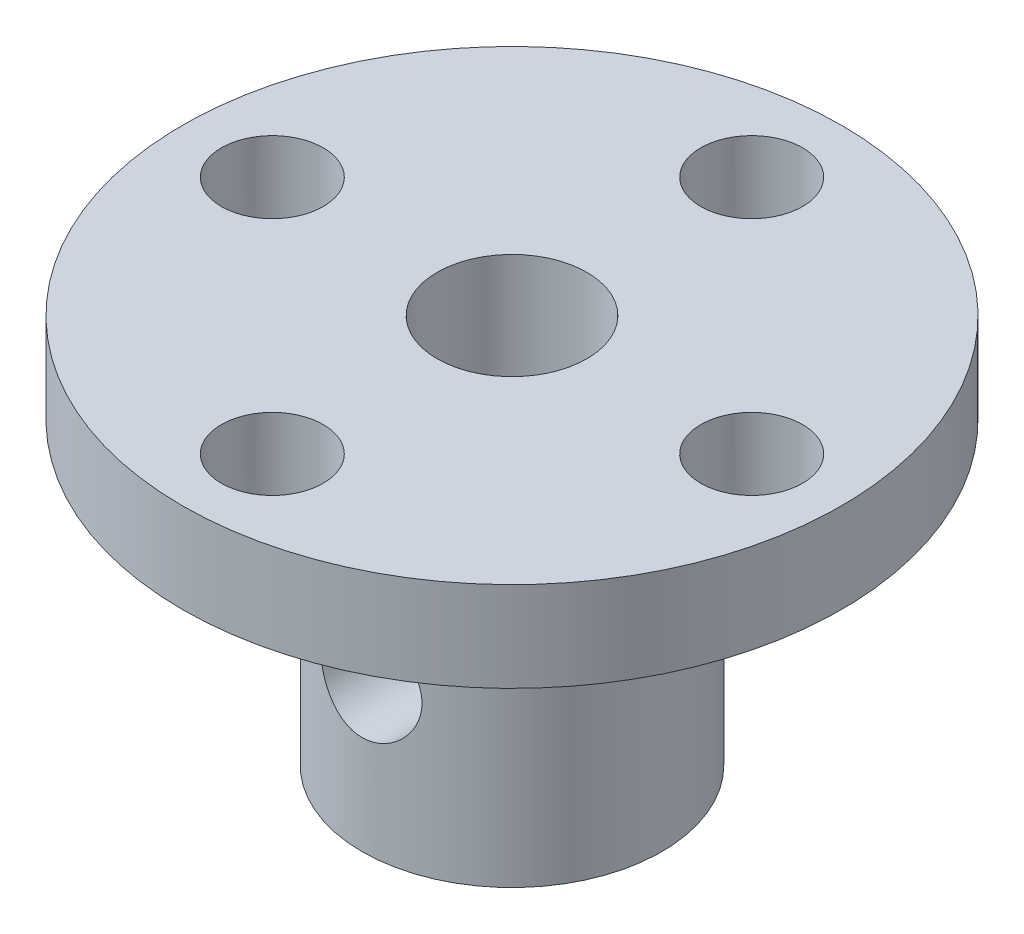
ISO-10303-21;
HEADER;
FILE_DESCRIPTION(('STEP AP214'),'2;1');
FILE_NAME('part.step','',(''),(''),'','','');
FILE_SCHEMA(('AUTOMOTIVE_DESIGN { 1 0 10303 214 1 1 1 1 }'));
ENDSEC;
DATA;
#1=APPLICATION_CONTEXT('core data for automotive mechanical design processes');
#2=APPLICATION_PROTOCOL_DEFINITION('international standard','automotive_design',2000,#1);
#3=PRODUCT_CONTEXT('',#1,'mechanical');
#4=PRODUCT('Part','Part','',(#3));
#5=PRODUCT_RELATED_PRODUCT_CATEGORY('part','',(#4));
#6=PRODUCT_DEFINITION_FORMATION('','',#4);
#7=PRODUCT_DEFINITION_CONTEXT('part definition',#1,'design');
#8=PRODUCT_DEFINITION('design','',#6,#7);
#9=PRODUCT_DEFINITION_SHAPE('','',#8);
#10=(LENGTH_UNIT() NAMED_UNIT(*) SI_UNIT(.MILLI.,.METRE.));
#11=(NAMED_UNIT(*) PLANE_ANGLE_UNIT() SI_UNIT($,.RADIAN.));
#12=(NAMED_UNIT(*) SI_UNIT($,.STERADIAN.) SOLID_ANGLE_UNIT());
#13=UNCERTAINTY_MEASURE_WITH_UNIT(LENGTH_MEASURE(1.E-05),#10,'distance_accuracy_value','');
#14=(GEOMETRIC_REPRESENTATION_CONTEXT(3) GLOBAL_UNCERTAINTY_ASSIGNED_CONTEXT((#13)) GLOBAL_UNIT_ASSIGNED_CONTEXT((#10,
#11,#12)) REPRESENTATION_CONTEXT('',''));
#15=CARTESIAN_POINT('',(0.,0.,0.));
#16=DIRECTION('',(0.,0.,1.));
#17=DIRECTION('',(1.,0.,0.));
#18=AXIS2_PLACEMENT_3D('',#15,#16,#17);
#19=CARTESIAN_POINT('',(0.,0.,0.));
#20=DIRECTION('',(0.,1.,0.));
#21=DIRECTION('',(0.,0.,1.));
#22=AXIS2_PLACEMENT_3D('',#19,#20,#21);
#23=CYLINDRICAL_SURFACE('',#22,2.5);
#24=CARTESIAN_POINT('',(0.,-9.7,2.5));
#25=CARTESIAN_POINT('',(-0.0850387979834848,-9.69999816919035,2.49999820045218));
#26=CARTESIAN_POINT('',(-0.170094671437286,-9.69358183789239,2.49562229986158));
#27=CARTESIAN_POINT('',(-0.337492388275739,-9.66831575022715,2.47854651486028));
#28=CARTESIAN_POINT('',(-0.419832331114429,-9.64945747328048,2.46584092609253));
#29=CARTESIAN_POINT('',(-0.579108454340916,-9.60048366597368,2.43335465994413));
#30=CARTESIAN_POINT('',(-0.656068830144872,-9.57042298816727,2.41360847686574));
#31=CARTESIAN_POINT('',(-0.803514973680363,-9.50034485089679,2.36861016322125));
#32=CARTESIAN_POINT('',(-0.874000009216633,-9.46032626734112,2.34335741108957));
#33=CARTESIAN_POINT('',(-1.01337366890706,-9.36772415903246,2.28674616980003));
#34=CARTESIAN_POINT('',(-1.0815991382831,-9.31435414759578,2.25504877517144));
#35=CARTESIAN_POINT('',(-1.20875003224094,-9.19847308611668,2.18953227494941));
#36=CARTESIAN_POINT('',(-1.26766159293667,-9.13594867115336,2.155710109245));
#37=CARTESIAN_POINT('',(-1.38446899403555,-8.99158688341645,2.08295824442802));
#38=CARTESIAN_POINT('',(-1.44059228114778,-8.9082651704508,2.04410693403086));
#39=CARTESIAN_POINT('',(-1.53800972389857,-8.73122566981653,1.97185248931013));
#40=CARTESIAN_POINT('',(-1.57932936950988,-8.63752611931998,1.93844004463229));
#41=CARTESIAN_POINT('',(-1.63522311266715,-8.47044832260778,1.89128675533774));
#42=CARTESIAN_POINT('',(-1.65409801477158,-8.39933490488056,1.87465093047625));
#43=CARTESIAN_POINT('',(-1.68254681011808,-8.2539654690051,1.84916448936811));
#44=CARTESIAN_POINT('',(-1.69213746234582,-8.17971536678123,1.84029984811191));
#45=CARTESIAN_POINT('',(-1.7014076645876,-8.02969224596624,1.83173658107529));
#46=CARTESIAN_POINT('',(-1.70104041743351,-7.95391370959476,1.83208123428244));
#47=CARTESIAN_POINT('',(-1.69030603449941,-7.80366258120933,1.84198588990734));
#48=CARTESIAN_POINT('',(-1.67993165264924,-7.72919097531849,1.8515525699029));
#49=CARTESIAN_POINT('',(-1.65069558850256,-7.58748178382321,1.87764635160803));
#50=CARTESIAN_POINT('',(-1.63230757581304,-7.52006964366357,1.89378208556674));
#51=CARTESIAN_POINT('',(-1.58800348211448,-7.38924401217164,1.9310834944966));
#52=CARTESIAN_POINT('',(-1.5620815679323,-7.32583366573348,1.95225306463044));
#53=CARTESIAN_POINT('',(-1.48903308336162,-7.17356477799766,2.00893598830685));
#54=CARTESIAN_POINT('',(-1.43773561962917,-7.08742225248577,2.04640180877656));
#55=CARTESIAN_POINT('',(-1.32142250590536,-6.92586022844685,2.12337594234622));
#56=CARTESIAN_POINT('',(-1.25638136281509,-6.85046109911318,2.16288794663178));
#57=CARTESIAN_POINT('',(-1.1128802252985,-6.71097372045565,2.24013375397947));
#58=CARTESIAN_POINT('',(-1.0343088393304,-6.64698914168683,2.27784918215283));
#59=CARTESIAN_POINT('',(-0.865266038931109,-6.53314996736328,2.34725788975748));
#60=CARTESIAN_POINT('',(-0.774819769206677,-6.48326619849527,2.3789635573728));
#61=CARTESIAN_POINT('',(-0.605159061246368,-6.40929299225921,2.4268802615744));
#62=CARTESIAN_POINT('',(-0.527897125459445,-6.38193715500694,2.44496795068439));
#63=CARTESIAN_POINT('',(-0.368968841896279,-6.33848490633598,2.4739375638285));
#64=CARTESIAN_POINT('',(-0.287305503086238,-6.32238090531335,2.48482434476418));
#65=CARTESIAN_POINT('',(-0.121529839774144,-6.30228892932159,2.49843299560338));
#66=CARTESIAN_POINT('',(-0.0374102117070915,-6.298341826192,2.50112732185249));
#67=CARTESIAN_POINT('',(0.130331298151461,-6.30292816516318,2.49800917075232));
#68=CARTESIAN_POINT('',(0.21395315492412,-6.31146222935868,2.49219626938008));
#69=CARTESIAN_POINT('',(0.373718819283994,-6.33970808055415,2.47314960719664));
#70=CARTESIAN_POINT('',(0.450023874184558,-6.35880178575994,2.46032660474559));
#71=CARTESIAN_POINT('',(0.598117572107219,-6.40678953403525,2.42857915328153));
#72=CARTESIAN_POINT('',(0.669905383912479,-6.43568537457794,2.40965358523792));
#73=CARTESIAN_POINT('',(0.813310568306946,-6.50488509849219,2.36529191361636));
#74=CARTESIAN_POINT('',(0.884447707868842,-6.54592083059119,2.33945396806687));
#75=CARTESIAN_POINT('',(1.01913829164751,-6.63692451325472,2.28400365117534));
#76=CARTESIAN_POINT('',(1.08268588648568,-6.68689928012327,2.25438840449848));
#77=CARTESIAN_POINT('',(1.21159250163253,-6.80382410071078,2.18817956465319));
#78=CARTESIAN_POINT('',(1.27547219322557,-6.87221540844376,2.1512479663252));
#79=CARTESIAN_POINT('',(1.39140728392378,-7.01881473457776,2.07814369829383));
#80=CARTESIAN_POINT('',(1.4434575336035,-7.0970270051902,2.04197136529798));
#81=CARTESIAN_POINT('',(1.52827461800486,-7.25100985075856,1.97908192078089));
#82=CARTESIAN_POINT('',(1.56271820387907,-7.32560053383679,1.95174967870049));
#83=CARTESIAN_POINT('',(1.62089191913631,-7.48082219985601,1.90371742143551));
#84=CARTESIAN_POINT('',(1.64464309846824,-7.56144094714709,1.88300439865731));
#85=CARTESIAN_POINT('',(1.67718952904881,-7.71356040000685,1.85403198314878));
#86=CARTESIAN_POINT('',(1.68780154379834,-7.78438134425943,1.84428507886801));
#87=CARTESIAN_POINT('',(1.69996253708634,-7.92742679040034,1.83308551982077));
#88=CARTESIAN_POINT('',(1.7015195480108,-7.99964999130525,1.83162551405604));
#89=CARTESIAN_POINT('',(1.69547326531972,-8.14331792150091,1.83722169324658));
#90=CARTESIAN_POINT('',(1.68787518523037,-8.21476307049708,1.84427303127279));
#91=CARTESIAN_POINT('',(1.66403320231914,-8.35507041534437,1.86580919687691));
#92=CARTESIAN_POINT('',(1.64777716863889,-8.42392884160363,1.88030445327829));
#93=CARTESIAN_POINT('',(1.60094460199694,-8.57922074841455,1.92046844748918));
#94=CARTESIAN_POINT('',(1.56744977057553,-8.66422473018103,1.94822855768219));
#95=CARTESIAN_POINT('',(1.48842968765724,-8.82627881510156,2.00924547590857));
#96=CARTESIAN_POINT('',(1.44288630302162,-8.90331668408771,2.04251054043213));
#97=CARTESIAN_POINT('',(1.33981814286364,-9.05028484250694,2.11159075672139));
#98=CARTESIAN_POINT('',(1.28207015065392,-9.12004034985932,2.14744382013087));
#99=CARTESIAN_POINT('',(1.15587100765968,-9.24986321534851,2.21792476806556));
#100=CARTESIAN_POINT('',(1.08741680245331,-9.30992779875399,2.25255229948556));
#101=CARTESIAN_POINT('',(0.931199264459169,-9.42600361964638,2.3218646585193));
#102=CARTESIAN_POINT('',(0.842090086087509,-9.48055356732956,2.3560083215469));
#103=CARTESIAN_POINT('',(0.652961687228427,-9.57310333020729,2.41524103854633));
#104=CARTESIAN_POINT('',(0.552966275868174,-9.61113839025044,2.44034935526572));
#105=CARTESIAN_POINT('',(0.376874622578949,-9.65940222448465,2.47253035117779));
#106=CARTESIAN_POINT('',(0.302680761927055,-9.67455954062636,2.48275980997064));
#107=CARTESIAN_POINT('',(0.152328518517495,-9.69485681297588,2.49649380541537));
#108=CARTESIAN_POINT('',(0.076171109234168,-9.7000016398962,2.5000016118943));
#109=CARTESIAN_POINT('',(0.,-9.7,2.5));
#110=B_SPLINE_CURVE_WITH_KNOTS('',3,(#24,#25,#26,#27,#28,#29,#30,#31,#32,#33,#34,#35,#36,#37,
#38,#39,#40,#41,#42,#43,#44,#45,#46,#47,#48,#49,#50,#51,#52,#53,#54,#55,#56,#57,#58,#59,#60,#61,
#62,#63,#64,#65,#66,#67,#68,#69,#70,#71,#72,#73,#74,#75,#76,#77,#78,#79,#80,#81,#82,#83,#84,#85,
#86,#87,#88,#89,#90,#91,#92,#93,#94,#95,#96,#97,#98,#99,#100,#101,#102,#103,#104,#105,#106,#107,
#108,#109),.UNSPECIFIED.,.T.,.F.,(4,2,2,2,2,2,2,2,2,2,2,2,2,2,2,2,2,2,2,2,2,2,2,2,2,2,2,2,2,2,2,
2,2,2,2,2,2,2,2,2,2,2,4),(0.,0.254806043376852,0.509786766173397,0.763535038784819,
1.01731196860687,1.29299784521619,1.56909029718234,1.89075274241483,2.21185863366403,
2.437277841313,2.66228938211532,2.8883585475845,3.11459153054119,3.32895928464962,
3.54349345859415,3.86291980865568,4.18294394584567,4.50574110855304,4.8278654614578,
5.07860737999838,5.3291800040525,5.58059414593946,5.83202081940594,6.07008670846269,
6.30819627663255,6.56550023671314,6.82300124238575,7.12363148864913,7.42439235142902,
7.68322070076114,7.94153724687304,8.15738869986265,8.37304864912747,8.58858584509552,
8.80442583274324,9.08935427216589,9.37471399434786,9.66583168384323,9.95703257957837,
10.2848789812577,10.6120222367958,10.8403686867611,11.0686040266745),.UNSPECIFIED.);
#111=CARTESIAN_POINT('',(0.,-9.7,2.5));
#112=VERTEX_POINT('',#111);
#113=EDGE_CURVE('E95',#112,#112,#110,.T.);
#114=ORIENTED_EDGE('',*,*,#113,.F.);
#115=EDGE_LOOP('',(#114));
#116=FACE_BOUND('',#115,.T.);
#117=CARTESIAN_POINT('',(1.7,-8.,-1.83303027798233));
#118=CARTESIAN_POINT('',(1.69999299825594,-7.91758321096291,-1.833042992038));
#119=CARTESIAN_POINT('',(1.6939500259275,-7.83511265668928,-1.83869836227265));
#120=CARTESIAN_POINT('',(1.67030428410977,-7.67316273800046,-1.86019239542275));
#121=CARTESIAN_POINT('',(1.65267678365595,-7.59369015840795,-1.87605284289397));
#122=CARTESIAN_POINT('',(1.60730046717366,-7.44062417631794,-1.91506158838919));
#123=CARTESIAN_POINT('',(1.57965662833664,-7.36697911281454,-1.93813396862045));
#124=CARTESIAN_POINT('',(1.51532619709133,-7.22551198408259,-1.98883449444973));
#125=CARTESIAN_POINT('',(1.47863828787503,-7.15769076874136,-2.01646330326535));
#126=CARTESIAN_POINT('',(1.39030897742011,-7.01767286324254,-2.07855886955535));
#127=CARTESIAN_POINT('',(1.33720445424257,-6.94656766734073,-2.11340580544151));
#128=CARTESIAN_POINT('',(1.22050327301926,-6.81331376634913,-2.18288692234093));
#129=CARTESIAN_POINT('',(1.15689482473875,-6.75117527458599,-2.21752081839085));
#130=CARTESIAN_POINT('',(1.00926498416445,-6.62814969989615,-2.2889064278703));
#131=CARTESIAN_POINT('',(0.923609248834712,-6.56891242114938,-2.32516985775635));
#132=CARTESIAN_POINT('',(0.74063568492206,-6.46624542503717,-2.38973088220103));
#133=CARTESIAN_POINT('',(0.643340069746641,-6.42278621712146,-2.41804331516862));
#134=CARTESIAN_POINT('',(0.466090281764163,-6.3631954190937,-2.45739154304163));
#135=CARTESIAN_POINT('',(0.388091477594829,-6.3429132419343,-2.4709962385626));
#136=CARTESIAN_POINT('',(0.229104081568658,-6.31357518122725,-2.49076450437111));
#137=CARTESIAN_POINT('',(0.148117842522575,-6.30451064951682,-2.49693380682536));
#138=CARTESIAN_POINT('',(-0.0146730067461935,-6.29810910992981,-2.50128512591129));
#139=CARTESIAN_POINT('',(-0.0964787754687097,-6.30079209361319,-2.49945352686761));
#140=CARTESIAN_POINT('',(-0.25831619346349,-6.3177702635669,-2.48794264078123));
#141=CARTESIAN_POINT('',(-0.338347316277198,-6.33206884955192,-2.47826105616564));
#142=CARTESIAN_POINT('',(-0.492990133399101,-6.3711326984973,-2.45214256845429));
#143=CARTESIAN_POINT('',(-0.567674855208822,-6.39569872271234,-2.43583441258952));
#144=CARTESIAN_POINT('',(-0.711737013678601,-6.45420520378488,-2.39770520891413));
#145=CARTESIAN_POINT('',(-0.781113438106279,-6.48814744291986,-2.37588311305376));
#146=CARTESIAN_POINT('',(-0.921069468036053,-6.56861486209762,-2.32546096665101));
#147=CARTESIAN_POINT('',(-0.990903361932715,-6.61612707720158,-2.29637419135017));
#148=CARTESIAN_POINT('',(-1.12208148580497,-6.72017341691366,-2.23521438853118));
#149=CARTESIAN_POINT('',(-1.18341578737437,-6.77671792902377,-2.20313794067862));
#150=CARTESIAN_POINT('',(-1.30667129009991,-6.90818654927433,-2.1327110615135));
#151=CARTESIAN_POINT('',(-1.36692794040077,-6.98460138707253,-2.09421918264252));
#152=CARTESIAN_POINT('',(-1.47409066776089,-7.14761562817509,-2.02022042359034));
#153=CARTESIAN_POINT('',(-1.52100384470685,-7.2342095805093,-1.98471196308527));
#154=CARTESIAN_POINT('',(-1.59053676253794,-7.39507042077658,-1.92916739266986));
#155=CARTESIAN_POINT('',(-1.61627854828542,-7.46740094459001,-1.9074585270901));
#156=CARTESIAN_POINT('',(-1.65798597242961,-7.61652486868682,-1.87132326372443));
#157=CARTESIAN_POINT('',(-1.6739695419461,-7.69330979766226,-1.8568835172575));
#158=CARTESIAN_POINT('',(-1.69525405222778,-7.85025556438426,-1.83748146735015));
#159=CARTESIAN_POINT('',(-1.70046522669629,-7.93043913233893,-1.83259882088175));
#160=CARTESIAN_POINT('',(-1.69946920837653,-8.09067572546454,-1.83352254061268));
#161=CARTESIAN_POINT('',(-1.69326206895215,-8.17072875124382,-1.83932885685677));
#162=CARTESIAN_POINT('',(-1.67131602401827,-8.31885455327627,-1.85926844629543));
#163=CARTESIAN_POINT('',(-1.65674589375608,-8.38725185611231,-1.87237567751987));
#164=CARTESIAN_POINT('',(-1.61983627504598,-8.52049772548527,-1.90439666184418));
#165=CARTESIAN_POINT('',(-1.59748957406153,-8.58534293271383,-1.92331580340045));
#166=CARTESIAN_POINT('',(-1.5340216642498,-8.73926630308377,-1.97461384544063));
#167=CARTESIAN_POINT('',(-1.48898228657027,-8.82599333323915,-2.00920530451476));
#168=CARTESIAN_POINT('',(-1.3856504984353,-8.98962954394469,-2.08181979776592));
#169=CARTESIAN_POINT('',(-1.32733343259225,-9.06652003880719,-2.11984913552455));
#170=CARTESIAN_POINT('',(-1.19749285361277,-9.21059521783459,-2.19584935770965));
#171=CARTESIAN_POINT('',(-1.12579335246862,-9.2776263534012,-2.23381172260553));
#172=CARTESIAN_POINT('',(-0.970649047201116,-9.39911221151037,-2.30545356280577));
#173=CARTESIAN_POINT('',(-0.887223048410995,-9.45358670846394,-2.33913973421533));
#174=CARTESIAN_POINT('',(-0.725543946959799,-9.5396212580326,-2.39364485382694));
#175=CARTESIAN_POINT('',(-0.648953223129148,-9.57352507453121,-2.41568448662001));
#176=CARTESIAN_POINT('',(-0.490099911923209,-9.62999766969926,-2.45284280370079));
#177=CARTESIAN_POINT('',(-0.40784099372217,-9.65257370418971,-2.46796591769776));
#178=CARTESIAN_POINT('',(-0.239351896987992,-9.68526114520627,-2.48997130115417));
#179=CARTESIAN_POINT('',(-0.153104423276447,-9.69531168911075,-2.49681332737465));
#180=CARTESIAN_POINT('',(0.0201531513842123,-9.7020878991026,-2.50141875634136));
#181=CARTESIAN_POINT('',(0.107163079008308,-9.69881651901132,-2.49918417161155));
#182=CARTESIAN_POINT('',(0.271935874566285,-9.67998974687627,-2.48642820723522));
#183=CARTESIAN_POINT('',(0.349874108881403,-9.66545808010435,-2.47659761706157));
#184=CARTESIAN_POINT('',(0.501922799990803,-9.62611328137348,-2.45031237073743));
#185=CARTESIAN_POINT('',(0.576032458632183,-9.60129801521647,-2.43385633960186));
#186=CARTESIAN_POINT('',(0.722532276364941,-9.54095357258635,-2.39457443302464));
#187=CARTESIAN_POINT('',(0.794650573385669,-9.50495018651884,-2.37147088854441));
#188=CARTESIAN_POINT('',(0.931977535969296,-9.42400105509677,-2.3209437754299));
#189=CARTESIAN_POINT('',(0.997184469525268,-9.37905307628482,-2.29351912817671));
#190=CARTESIAN_POINT('',(1.12976847497711,-9.27353537254226,-2.23154260255219));
#191=CARTESIAN_POINT('',(1.19586803432497,-9.21162007289862,-2.1965486337672));
#192=CARTESIAN_POINT('',(1.31743718098539,-9.07820458165238,-2.12586931779368));
#193=CARTESIAN_POINT('',(1.37288253166921,-9.00668315063644,-2.09018259291504));
#194=CARTESIAN_POINT('',(1.47882293693166,-8.84478229159108,-2.01686437675624));
#195=CARTESIAN_POINT('',(1.52769578951015,-8.7531598019506,-1.97959900620408));
#196=CARTESIAN_POINT('',(1.60856325455284,-8.55980633454891,-1.91448354404553));
#197=CARTESIAN_POINT('',(1.64063109439845,-8.45812154776556,-1.88659279677813));
#198=CARTESIAN_POINT('',(1.6751398739471,-8.29556031631296,-1.85584695636803));
#199=CARTESIAN_POINT('',(1.68442213220839,-8.2371585948241,-1.847374664825));
#200=CARTESIAN_POINT('',(1.69685316808719,-8.11918021382415,-1.83596313456793));
#201=CARTESIAN_POINT('',(1.70000506369065,-8.0596041671747,-1.833021083124));
#202=CARTESIAN_POINT('',(1.7,-8.,-1.83303027798233));
#203=B_SPLINE_CURVE_WITH_KNOTS('',3,(#117,#118,#119,#120,#121,#122,#123,#124,#125,#126,#127,
#128,#129,#130,#131,#132,#133,#134,#135,#136,#137,#138,#139,#140,#141,#142,#143,#144,#145,#146,
#147,#148,#149,#150,#151,#152,#153,#154,#155,#156,#157,#158,#159,#160,#161,#162,#163,#164,#165,
#166,#167,#168,#169,#170,#171,#172,#173,#174,#175,#176,#177,#178,#179,#180,#181,#182,#183,#184,
#185,#186,#187,#188,#189,#190,#191,#192,#193,#194,#195,#196,#197,#198,#199,#200,#201,#202),
.UNSPECIFIED.,.T.,.F.,(4,2,2,2,2,2,2,2,2,2,2,2,2,2,2,2,2,2,2,2,2,2,2,2,2,2,2,2,2,2,2,2,2,2,2,2,
2,2,2,2,2,2,4),(0.,0.246969126795219,0.494467210180479,0.73944303742731,0.984454554009796,
1.26944098451961,1.55474950276616,1.88376282886939,2.21215799618586,2.45629811848155,
2.7002499052214,2.94461700280405,3.18905564879568,3.42895636361194,3.66890271136348,
3.93589334011588,4.20319325914729,4.51582538501159,4.82829085090702,5.06676751309286,
5.30480463529953,5.54481745192121,5.7848291468374,5.99744693218817,6.21026244205946,
6.51961788569973,6.82955252655786,7.14389402275262,7.45773705393497,7.71649177595234,
7.97508054470867,8.23492098433632,8.49470381363353,8.73329713545304,8.97193999835222,
9.2225310162527,9.47318468521495,9.76334044772652,10.0541486507919,10.3833833558052,
10.7111712435172,10.889871263923,11.0684803712721),.UNSPECIFIED.);
#204=CARTESIAN_POINT('',(1.7,-8.,-1.83303027798233));
#205=VERTEX_POINT('',#204);
#206=EDGE_CURVE('E90',#205,#205,#203,.T.);
#207=ORIENTED_EDGE('',*,*,#206,.F.);
#208=EDGE_LOOP('',(#207));
#209=FACE_BOUND('',#208,.T.);
#210=CARTESIAN_POINT('',(0.,0.,0.));
#211=DIRECTION('',(0.,1.,0.));
#212=DIRECTION('',(0.,0.,1.));
#213=AXIS2_PLACEMENT_3D('',#210,#211,#212);
#214=CIRCLE('',#213,2.5);
#215=CARTESIAN_POINT('',(0.,0.,2.5));
#216=VERTEX_POINT('',#215);
#217=EDGE_CURVE('E10',#216,#216,#214,.T.);
#218=ORIENTED_EDGE('',*,*,#217,.T.);
#219=EDGE_LOOP('',(#218));
#220=FACE_BOUND('',#219,.T.);
#221=CARTESIAN_POINT('',(0.,-13.,0.));
#222=DIRECTION('',(0.,1.,0.));
#223=DIRECTION('',(0.,0.,1.));
#224=AXIS2_PLACEMENT_3D('',#221,#222,#223);
#225=CIRCLE('',#224,2.5);
#226=CARTESIAN_POINT('',(0.,-13.,2.5));
#227=VERTEX_POINT('',#226);
#228=EDGE_CURVE('E67',#227,#227,#225,.T.);
#229=ORIENTED_EDGE('',*,*,#228,.F.);
#230=EDGE_LOOP('',(#229));
#231=FACE_BOUND('',#230,.T.);
#232=ADVANCED_FACE('F33',(#116,#209,#220,#231),#23,.F.);
#233=CARTESIAN_POINT('',(-2.5,0.,0.));
#234=DIRECTION('',(0.,1.,0.));
#235=DIRECTION('',(0.,0.,1.));
#236=AXIS2_PLACEMENT_3D('',#233,#234,#235);
#237=PLANE('',#236);
#238=CARTESIAN_POINT('',(0.,0.,-8.));
#239=DIRECTION('',(0.,1.,0.));
#240=DIRECTION('',(0.,0.,1.));
#241=AXIS2_PLACEMENT_3D('',#238,#239,#240);
#242=CIRCLE('',#241,1.7);
#243=CARTESIAN_POINT('',(0.,0.,-6.3));
#244=VERTEX_POINT('',#243);
#245=EDGE_CURVE('E59',#244,#244,#242,.T.);
#246=ORIENTED_EDGE('',*,*,#245,.F.);
#247=EDGE_LOOP('',(#246));
#248=FACE_BOUND('',#247,.T.);
#249=CARTESIAN_POINT('',(8.00000000000023,0.,-2.25904099284255E-13));
#250=DIRECTION('',(0.,1.,0.));
#251=DIRECTION('',(0.,0.,1.));
#252=AXIS2_PLACEMENT_3D('',#249,#250,#251);
#253=CIRCLE('',#252,1.70000000000018);
#254=CARTESIAN_POINT('',(8.00000000000023,0.,1.69999999999995));
#255=VERTEX_POINT('',#254);
#256=EDGE_CURVE('E104',#255,#255,#253,.T.);
#257=ORIENTED_EDGE('',*,*,#256,.F.);
#258=EDGE_LOOP('',(#257));
#259=FACE_BOUND('',#258,.T.);
#260=CARTESIAN_POINT('',(4.51808198568511E-13,0.,8.));
#261=DIRECTION('',(0.,1.,0.));
#262=DIRECTION('',(0.,0.,1.));
#263=AXIS2_PLACEMENT_3D('',#260,#261,#262);
#264=CIRCLE('',#263,1.70000000000049);
#265=CARTESIAN_POINT('',(4.51808198568511E-13,0.,9.70000000000049));
#266=VERTEX_POINT('',#265);
#267=EDGE_CURVE('E107',#266,#266,#264,.T.);
#268=ORIENTED_EDGE('',*,*,#267,.F.);
#269=EDGE_LOOP('',(#268));
#270=FACE_BOUND('',#269,.T.);
#271=CARTESIAN_POINT('',(-7.99999999999977,0.,2.26883816723573E-13));
#272=DIRECTION('',(0.,1.,0.));
#273=DIRECTION('',(0.,0.,1.));
#274=AXIS2_PLACEMENT_3D('',#271,#272,#273);
#275=CIRCLE('',#274,1.70000000000036);
#276=CARTESIAN_POINT('',(-7.99999999999977,0.,1.70000000000059));
#277=VERTEX_POINT('',#276);
#278=EDGE_CURVE('E101',#277,#277,#275,.T.);
#279=ORIENTED_EDGE('',*,*,#278,.F.);
#280=EDGE_LOOP('',(#279));
#281=FACE_BOUND('',#280,.T.);
#282=CARTESIAN_POINT('',(0.,0.,0.));
#283=DIRECTION('',(0.,1.,0.));
#284=DIRECTION('',(0.,0.,1.));
#285=AXIS2_PLACEMENT_3D('',#282,#283,#284);
#286=CIRCLE('',#285,11.);
#287=CARTESIAN_POINT('',(0.,0.,11.));
#288=VERTEX_POINT('',#287);
#289=EDGE_CURVE('E46',#288,#288,#286,.T.);
#290=ORIENTED_EDGE('',*,*,#289,.T.);
#291=EDGE_LOOP('',(#290));
#292=FACE_BOUND('',#291,.T.);
#293=ORIENTED_EDGE('',*,*,#217,.F.);
#294=EDGE_LOOP('',(#293));
#295=FACE_BOUND('',#294,.T.);
#296=ADVANCED_FACE('F134',(#248,#259,#270,#281,#292,#295),#237,.T.);
#297=CARTESIAN_POINT('',(0.,0.,0.));
#298=DIRECTION('',(0.,1.,0.));
#299=DIRECTION('',(0.,0.,1.));
#300=AXIS2_PLACEMENT_3D('',#297,#298,#299);
#301=CYLINDRICAL_SURFACE('',#300,11.);
#302=CARTESIAN_POINT('',(0.,-3.,0.));
#303=DIRECTION('',(0.,1.,0.));
#304=DIRECTION('',(0.,0.,1.));
#305=AXIS2_PLACEMENT_3D('',#302,#303,#304);
#306=CIRCLE('',#305,11.);
#307=CARTESIAN_POINT('',(0.,-3.,11.));
#308=VERTEX_POINT('',#307);
#309=EDGE_CURVE('E51',#308,#308,#306,.T.);
#310=ORIENTED_EDGE('',*,*,#309,.T.);
#311=EDGE_LOOP('',(#310));
#312=FACE_BOUND('',#311,.T.);
#313=ORIENTED_EDGE('',*,*,#289,.F.);
#314=EDGE_LOOP('',(#313));
#315=FACE_BOUND('',#314,.T.);
#316=ADVANCED_FACE('F122',(#312,#315),#301,.T.);
#317=CARTESIAN_POINT('',(-11.,-3.,0.));
#318=DIRECTION('',(0.,-1.,0.));
#319=DIRECTION('',(0.,0.,-1.));
#320=AXIS2_PLACEMENT_3D('',#317,#318,#319);
#321=PLANE('',#320);
#322=CARTESIAN_POINT('',(0.,-3.,-8.));
#323=DIRECTION('',(0.,-1.,0.));
#324=DIRECTION('',(0.,0.,-1.));
#325=AXIS2_PLACEMENT_3D('',#322,#323,#324);
#326=CIRCLE('',#325,1.7);
#327=CARTESIAN_POINT('',(0.,-3.,-9.7));
#328=VERTEX_POINT('',#327);
#329=EDGE_CURVE('E65',#328,#328,#326,.T.);
#330=ORIENTED_EDGE('',*,*,#329,.F.);
#331=EDGE_LOOP('',(#330));
#332=FACE_BOUND('',#331,.T.);
#333=CARTESIAN_POINT('',(8.00000000000023,-3.,-2.25904099284255E-13));
#334=DIRECTION('',(0.,-1.,0.));
#335=DIRECTION('',(0.,0.,-1.));
#336=AXIS2_PLACEMENT_3D('',#333,#334,#335);
#337=CIRCLE('',#336,1.70000000000018);
#338=CARTESIAN_POINT('',(8.00000000000023,-3.,-1.7000000000004));
#339=VERTEX_POINT('',#338);
#340=EDGE_CURVE('E62',#339,#339,#337,.T.);
#341=ORIENTED_EDGE('',*,*,#340,.F.);
#342=EDGE_LOOP('',(#341));
#343=FACE_BOUND('',#342,.T.);
#344=CARTESIAN_POINT('',(4.51808198568511E-13,-3.,8.));
#345=DIRECTION('',(0.,-1.,0.));
#346=DIRECTION('',(0.,0.,-1.));
#347=AXIS2_PLACEMENT_3D('',#344,#345,#346);
#348=CIRCLE('',#347,1.70000000000049);
#349=CARTESIAN_POINT('',(4.51808198568511E-13,-3.,6.29999999999951));
#350=VERTEX_POINT('',#349);
#351=EDGE_CURVE('E58',#350,#350,#348,.T.);
#352=ORIENTED_EDGE('',*,*,#351,.F.);
#353=EDGE_LOOP('',(#352));
#354=FACE_BOUND('',#353,.T.);
#355=CARTESIAN_POINT('',(-7.99999999999977,-3.,2.26883816723573E-13));
#356=DIRECTION('',(0.,-1.,0.));
#357=DIRECTION('',(0.,0.,-1.));
#358=AXIS2_PLACEMENT_3D('',#355,#356,#357);
#359=CIRCLE('',#358,1.70000000000036);
#360=CARTESIAN_POINT('',(-7.99999999999977,-3.,-1.70000000000014));
#361=VERTEX_POINT('',#360);
#362=EDGE_CURVE('E55',#361,#361,#359,.T.);
#363=ORIENTED_EDGE('',*,*,#362,.F.);
#364=EDGE_LOOP('',(#363));
#365=FACE_BOUND('',#364,.T.);
#366=CARTESIAN_POINT('',(0.,-3.,0.));
#367=DIRECTION('',(0.,1.,0.));
#368=DIRECTION('',(0.,0.,1.));
#369=AXIS2_PLACEMENT_3D('',#366,#367,#368);
#370=CIRCLE('',#369,5.);
#371=CARTESIAN_POINT('',(0.,-3.,5.));
#372=VERTEX_POINT('',#371);
#373=EDGE_CURVE('E117',#372,#372,#370,.T.);
#374=ORIENTED_EDGE('',*,*,#373,.T.);
#375=EDGE_LOOP('',(#374));
#376=FACE_BOUND('',#375,.T.);
#377=ORIENTED_EDGE('',*,*,#309,.F.);
#378=EDGE_LOOP('',(#377));
#379=FACE_BOUND('',#378,.T.);
#380=ADVANCED_FACE('F125',(#332,#343,#354,#365,#376,#379),#321,.T.);
#381=CARTESIAN_POINT('',(0.,0.,0.));
#382=DIRECTION('',(0.,1.,0.));
#383=DIRECTION('',(0.,0.,1.));
#384=AXIS2_PLACEMENT_3D('',#381,#382,#383);
#385=CYLINDRICAL_SURFACE('',#384,5.);
#386=CARTESIAN_POINT('',(0.,-9.7,5.));
#387=CARTESIAN_POINT('',(0.0926517266343189,-9.70000081321365,5.00000053974522));
#388=CARTESIAN_POINT('',(0.185297840904063,-9.69240106681847,4.99740114751481));
#389=CARTESIAN_POINT('',(0.367854879493357,-9.66230042037197,4.98728823519212));
#390=CARTESIAN_POINT('',(0.457765627979652,-9.63979856449953,4.97977439988791));
#391=CARTESIAN_POINT('',(0.632193758893057,-9.58075861520221,4.96064754933191));
#392=CARTESIAN_POINT('',(0.716720087292005,-9.5442445513148,4.94904155447656));
#393=CARTESIAN_POINT('',(0.878448155994959,-9.45832739247377,4.92291054631099));
#394=CARTESIAN_POINT('',(0.95564835716697,-9.40892159725996,4.90838492161116));
#395=CARTESIAN_POINT('',(1.10330104777894,-9.29676427675926,4.87735641140681));
#396=CARTESIAN_POINT('',(1.17345475248738,-9.23363297684879,4.86080478902837));
#397=CARTESIAN_POINT('',(1.30240933520338,-9.09662388036727,4.82785337521059));
#398=CARTESIAN_POINT('',(1.36120757602395,-9.02274359442562,4.81145361988067));
#399=CARTESIAN_POINT('',(1.46751676310472,-8.86360908824248,4.78012194528327));
#400=CARTESIAN_POINT('',(1.5146342174542,-8.77807922820964,4.765249144477));
#401=CARTESIAN_POINT('',(1.59368742072229,-8.59972213574938,4.73939901308068));
#402=CARTESIAN_POINT('',(1.62562801707973,-8.50689724438519,4.72842043897173));
#403=CARTESIAN_POINT('',(1.67229086342238,-8.31999018690957,4.71211616556767));
#404=CARTESIAN_POINT('',(1.68757470861678,-8.22606474406315,4.70660669024341));
#405=CARTESIAN_POINT('',(1.70224601987522,-8.03683339733164,4.7013216377617));
#406=CARTESIAN_POINT('',(1.70163863563478,-7.94152795065505,4.70154420308466));
#407=CARTESIAN_POINT('',(1.68497973610517,-7.75708202168226,4.70753742686055));
#408=CARTESIAN_POINT('',(1.66966776817159,-7.66786459850567,4.7130424030426));
#409=CARTESIAN_POINT('',(1.62524326611471,-7.49334980503203,4.72854439660695));
#410=CARTESIAN_POINT('',(1.59612901692085,-7.4080529233465,4.73854197223131));
#411=CARTESIAN_POINT('',(1.52445461215253,-7.24214705150006,4.76208737138908));
#412=CARTESIAN_POINT('',(1.48167960292961,-7.16163918857295,4.77569129011484));
#413=CARTESIAN_POINT('',(1.38404709599604,-7.00871317045461,4.80489379036339));
#414=CARTESIAN_POINT('',(1.32918599656144,-6.93629743648055,4.82049296590171));
#415=CARTESIAN_POINT('',(1.20541249685987,-6.79746459588536,4.85296665663681));
#416=CARTESIAN_POINT('',(1.13589758014164,-6.73158894258276,4.86986436164672));
#417=CARTESIAN_POINT('',(0.986600707966963,-6.61228586890227,4.90229000755873));
#418=CARTESIAN_POINT('',(0.906817687910975,-6.55885974091088,4.91781780614684));
#419=CARTESIAN_POINT('',(0.738065747013654,-6.4655126880099,4.9459724942496));
#420=CARTESIAN_POINT('',(0.649007778748742,-6.42574217528973,4.95856661266287));
#421=CARTESIAN_POINT('',(0.464934213977191,-6.36191705156505,4.97919637761369));
#422=CARTESIAN_POINT('',(0.369920787970966,-6.33785675096714,4.98723367430583));
#423=CARTESIAN_POINT('',(0.181213122779444,-6.3071066608089,4.99756827535267));
#424=CARTESIAN_POINT('',(0.0876511089460907,-6.29968563340741,5.00010703864746));
#425=CARTESIAN_POINT('',(-0.0994032937088896,-6.30033467733404,4.999886055746));
#426=CARTESIAN_POINT('',(-0.192895691907189,-6.30840201364582,4.99712724502307));
#427=CARTESIAN_POINT('',(-0.374194822366806,-6.33922329358536,4.9867805835677));
#428=CARTESIAN_POINT('',(-0.462087996787954,-6.36152381830612,4.97934191750242));
#429=CARTESIAN_POINT('',(-0.632846285894823,-6.41960698313038,4.96053327885743));
#430=CARTESIAN_POINT('',(-0.715710753328575,-6.45539135450361,4.94916280146496));
#431=CARTESIAN_POINT('',(-0.87654341745377,-6.54048938151176,4.92325998189486));
#432=CARTESIAN_POINT('',(-0.954320204575638,-6.59014075625401,4.90865088470727));
#433=CARTESIAN_POINT('',(-1.10067322620618,-6.70116915391498,4.87792165146136));
#434=CARTESIAN_POINT('',(-1.16924654001512,-6.7625498842082,4.86180103847107));
#435=CARTESIAN_POINT('',(-1.29862940515161,-6.8987310265994,4.82889544529531));
#436=CARTESIAN_POINT('',(-1.35891731537066,-6.9740293951596,4.81211516728288));
#437=CARTESIAN_POINT('',(-1.4660720834959,-7.13403115119973,4.78056093987685));
#438=CARTESIAN_POINT('',(-1.51293869733825,-7.21873470967248,4.76578702697119));
#439=CARTESIAN_POINT('',(-1.59173467815454,-7.39526267211923,4.74005345178856));
#440=CARTESIAN_POINT('',(-1.6236830155565,-7.48707785851399,4.7290889499445));
#441=CARTESIAN_POINT('',(-1.671510516179,-7.67524702691392,4.71239925775973));
#442=CARTESIAN_POINT('',(-1.68739730928129,-7.77159883105463,4.70667157984011));
#443=CARTESIAN_POINT('',(-1.70204116087892,-7.96057010806908,4.70139450040209));
#444=CARTESIAN_POINT('',(-1.70166753732276,-8.0531141802576,4.70153155060047));
#445=CARTESIAN_POINT('',(-1.68595415238094,-8.23674662705618,4.70718883464077));
#446=CARTESIAN_POINT('',(-1.67061535192663,-8.32783509475062,4.7127087228444));
#447=CARTESIAN_POINT('',(-1.6260326780679,-8.50409946796409,4.72827175700854));
#448=CARTESIAN_POINT('',(-1.5970813382002,-8.58935845546513,4.73821951873992));
#449=CARTESIAN_POINT('',(-1.52633517090782,-8.75387246759847,4.76147886133544));
#450=CARTESIAN_POINT('',(-1.48453742192914,-8.83312612137071,4.77479120725701));
#451=CARTESIAN_POINT('',(-1.38708829409553,-8.98725348194453,4.80402761878283));
#452=CARTESIAN_POINT('',(-1.3308973954893,-9.06176874978214,4.82004235884589));
#453=CARTESIAN_POINT('',(-1.20715702406168,-9.20059279640688,4.85251054927177));
#454=CARTESIAN_POINT('',(-1.13960427933381,-9.26489862475042,4.86896412485572));
#455=CARTESIAN_POINT('',(-0.991720635169,-9.38415185803213,4.90126937318731));
#456=CARTESIAN_POINT('',(-0.910978179048879,-9.43860502120632,4.91706838275857));
#457=CARTESIAN_POINT('',(-0.740959079368542,-9.53311220904018,4.94554300070808));
#458=CARTESIAN_POINT('',(-0.651684214685344,-9.57316922682254,4.9582192581695));
#459=CARTESIAN_POINT('',(-0.469994216414921,-9.63647981863849,4.97867393220817));
#460=CARTESIAN_POINT('',(-0.377765349792179,-9.66022093956854,4.98659347429703));
#461=CARTESIAN_POINT('',(-0.190355075697616,-9.69197821709496,4.99725544231626));
#462=CARTESIAN_POINT('',(-0.0951745767646333,-9.69999916464304,4.99999944555784));
#463=CARTESIAN_POINT('',(0.,-9.7,5.));
#464=B_SPLINE_CURVE_WITH_KNOTS('',3,(#386,#387,#388,#389,#390,#391,#392,#393,#394,#395,#396,
#397,#398,#399,#400,#401,#402,#403,#404,#405,#406,#407,#408,#409,#410,#411,#412,#413,#414,#415,
#416,#417,#418,#419,#420,#421,#422,#423,#424,#425,#426,#427,#428,#429,#430,#431,#432,#433,#434,
#435,#436,#437,#438,#439,#440,#441,#442,#443,#444,#445,#446,#447,#448,#449,#450,#451,#452,#453,
#454,#455,#456,#457,#458,#459,#460,#461,#462,#463),.UNSPECIFIED.,.T.,.F.,(4,2,2,2,2,2,2,2,2,2,2,
2,2,2,2,2,2,2,2,2,2,2,2,2,2,2,2,2,2,2,2,2,2,2,2,2,2,2,4),(0.,0.277604812454209,0.55522743220229,
0.832376069231255,1.10958280357735,1.39575019897966,1.68198397403888,1.97684250714305,
2.27160679998526,2.55609209992366,2.84048521098944,3.1112856133988,3.38211967427179,
3.65744251297918,3.93284751072061,4.22325088328035,4.51368438922706,4.8072213650612,
5.100651974812,5.38091125993656,5.66112105996142,5.93282188831578,6.2045576138179,
6.4835954271699,6.76272158415867,7.05506992492987,7.34742358166512,7.63940445541067,
7.9312465611922,8.20750633581869,8.48374837265226,8.75430780753004,9.02492881911905,
9.3077478097461,9.59064838453033,9.8851951862156,10.179680712788,10.4649314831929,
10.7500953057457),.UNSPECIFIED.);
#465=CARTESIAN_POINT('',(0.,-9.7,5.));
#466=VERTEX_POINT('',#465);
#467=EDGE_CURVE('E37',#466,#466,#464,.T.);
#468=ORIENTED_EDGE('',*,*,#467,.F.);
#469=EDGE_LOOP('',(#468));
#470=FACE_BOUND('',#469,.T.);
#471=CARTESIAN_POINT('',(1.7,-8.,-4.7021271782035));
#472=CARTESIAN_POINT('',(1.70000083454375,-8.09247671024169,-4.70212652194256));
#473=CARTESIAN_POINT('',(1.69242870923651,-8.18494775555932,-4.70488508126443));
#474=CARTESIAN_POINT('',(1.66244775059743,-8.3671427622526,-4.71556097706197));
#475=CARTESIAN_POINT('',(1.64003696400669,-8.45686636034627,-4.72347899269067));
#476=CARTESIAN_POINT('',(1.58126291046389,-8.63089608455648,-4.7434754891435));
#477=CARTESIAN_POINT('',(1.54492788897221,-8.71521277706069,-4.75554554247406));
#478=CARTESIAN_POINT('',(1.45943386286845,-8.87658195416848,-4.78247366817092));
#479=CARTESIAN_POINT('',(1.41027185367262,-8.95363273104496,-4.79733239352443));
#480=CARTESIAN_POINT('',(1.29837467194671,-9.10142086453823,-4.82884222933476));
#481=CARTESIAN_POINT('',(1.23520476543085,-9.17181934796544,-4.8455393045683));
#482=CARTESIAN_POINT('',(1.09801191148953,-9.30125564870166,-4.87845678431021));
#483=CARTESIAN_POINT('',(1.0239871444239,-9.36029155741592,-4.89467710835069));
#484=CARTESIAN_POINT('',(0.864693432862375,-9.4668787744596,-4.92534783339617));
#485=CARTESIAN_POINT('',(0.779172907363,-9.51407299343544,-4.93973790593414));
#486=CARTESIAN_POINT('',(0.600833256277237,-9.59327040444541,-4.96458352458178));
#487=CARTESIAN_POINT('',(0.508016191005188,-9.62527786691171,-4.97504017657606));
#488=CARTESIAN_POINT('',(0.321272723570079,-9.6720380739952,-4.99051509444578));
#489=CARTESIAN_POINT('',(0.227507209637132,-9.68737177383558,-4.99571598750178));
#490=CARTESIAN_POINT('',(0.0385994725331032,-9.70219858781671,-5.00074274740375));
#491=CARTESIAN_POINT('',(-0.0565423749458994,-9.7016959461263,-5.00057005438089));
#492=CARTESIAN_POINT('',(-0.241382097771988,-9.68522824885602,-4.99499170747059));
#493=CARTESIAN_POINT('',(-0.331143746450024,-9.6698946544241,-4.98979976393553));
#494=CARTESIAN_POINT('',(-0.506734255470695,-9.6252472930825,-4.97503643418539));
#495=CARTESIAN_POINT('',(-0.59256284621597,-9.59593256938183,-4.96546474824685));
#496=CARTESIAN_POINT('',(-0.759206561342271,-9.52379834798445,-4.94275007100429));
#497=CARTESIAN_POINT('',(-0.839939033628108,-9.48080304527529,-4.92956091559));
#498=CARTESIAN_POINT('',(-0.993226636814277,-9.38267449570772,-4.90097842010092));
#499=CARTESIAN_POINT('',(-1.06577942162155,-9.32753777978018,-4.88558445050251));
#500=CARTESIAN_POINT('',(-1.20439996959724,-9.20353018793847,-4.85332192905628));
#501=CARTESIAN_POINT('',(-1.26997767595032,-9.13411989287043,-4.83641807912283));
#502=CARTESIAN_POINT('',(-1.38872493069964,-8.98514895506948,-4.80367011822786));
#503=CARTESIAN_POINT('',(-1.44189240256895,-8.90558661709843,-4.78782618493151));
#504=CARTESIAN_POINT('',(-1.53502589229707,-8.73696002849422,-4.75879407140505));
#505=CARTESIAN_POINT('',(-1.57477659354932,-8.64776860031032,-4.74565042127558));
#506=CARTESIAN_POINT('',(-1.63852535861584,-8.463397711566,-4.72402172661412));
#507=CARTESIAN_POINT('',(-1.66253034568802,-8.36822090292747,-4.71553463490143));
#508=CARTESIAN_POINT('',(-1.69309083890647,-8.17934396150606,-4.70464619656837));
#509=CARTESIAN_POINT('',(-1.70040916615749,-8.08578257589202,-4.70197905671105));
#510=CARTESIAN_POINT('',(-1.69955565307547,-7.89875038190594,-4.70228801878616));
#511=CARTESIAN_POINT('',(-1.69138677402421,-7.80527955963651,-4.70526304189046));
#512=CARTESIAN_POINT('',(-1.66047724893076,-7.6246164478162,-4.71625534392992));
#513=CARTESIAN_POINT('',(-1.63827542017045,-7.53731938324519,-4.72408598154745));
#514=CARTESIAN_POINT('',(-1.58058151574919,-7.36771028498792,-4.74369940014614));
#515=CARTESIAN_POINT('',(-1.54508702470012,-7.28539916044858,-4.75548289935478));
#516=CARTESIAN_POINT('',(-1.46049899203865,-7.12511624773102,-4.78215067653986));
#517=CARTESIAN_POINT('',(-1.4109989860438,-7.04737413703822,-4.79712369407795));
#518=CARTESIAN_POINT('',(-1.30026121895317,-6.90102451188349,-4.82831489840599));
#519=CARTESIAN_POINT('',(-1.23901986418284,-6.83241980502973,-4.8445334655079));
#520=CARTESIAN_POINT('',(-1.10287590057702,-6.70271808211375,-4.8773765903905));
#521=CARTESIAN_POINT('',(-1.02744048224684,-6.6421734223799,-4.89398043774981));
#522=CARTESIAN_POINT('',(-0.867071356511243,-6.53456164265423,-4.92492097197535));
#523=CARTESIAN_POINT('',(-0.782137944357917,-6.48749410387807,-4.93925772928231));
#524=CARTESIAN_POINT('',(-0.605562992499805,-6.40859118592393,-4.96398853333037));
#525=CARTESIAN_POINT('',(-0.513967041076657,-6.37666179493427,-4.97440682887351));
#526=CARTESIAN_POINT('',(-0.326279600958925,-6.32879945332173,-4.99022992286063));
#527=CARTESIAN_POINT('',(-0.230189822477591,-6.31286046826056,-4.99563661251921));
#528=CARTESIAN_POINT('',(-0.0412847320444336,-6.29799161031275,-5.00067886842801));
#529=CARTESIAN_POINT('',(0.0514617684068314,-6.29827022447443,-5.00058299503759));
#530=CARTESIAN_POINT('',(0.235524998701216,-6.31386339743485,-4.99529808648695));
#531=CARTESIAN_POINT('',(0.326841851834334,-6.329176652338,-4.99010949299845));
#532=CARTESIAN_POINT('',(0.503894933746097,-6.37387343635898,-4.97532468724919));
#533=CARTESIAN_POINT('',(0.589699849092418,-6.40301212430122,-4.96580528761005));
#534=CARTESIAN_POINT('',(0.755232625464405,-6.47430367129714,-4.94333981389634));
#535=CARTESIAN_POINT('',(0.834959370027399,-6.51645891413635,-4.93039311222515));
#536=CARTESIAN_POINT('',(0.989365962188502,-6.61442124531217,-4.90179107732748));
#537=CARTESIAN_POINT('',(1.06374043677657,-6.67068478579715,-4.88605174991667));
#538=CARTESIAN_POINT('',(1.20224900233288,-6.79449927120364,-4.85382976209564));
#539=CARTESIAN_POINT('',(1.26637974652637,-6.86205389039225,-4.83734686099555));
#540=CARTESIAN_POINT('',(1.38527108066896,-7.00985722903249,-4.80468376561511));
#541=CARTESIAN_POINT('',(1.43953691950701,-7.09051419896728,-4.78854400376067));
#542=CARTESIAN_POINT('',(1.53371304894746,-7.26030884652173,-4.75921932721247));
#543=CARTESIAN_POINT('',(1.57362636225988,-7.34944473343489,-4.74603379056559));
#544=CARTESIAN_POINT('',(1.63670315378204,-7.53082575780652,-4.72464649214223));
#545=CARTESIAN_POINT('',(1.66035870443536,-7.62288201324546,-4.71629964142923));
#546=CARTESIAN_POINT('',(1.69200369351249,-7.80996160763429,-4.7050413642929));
#547=CARTESIAN_POINT('',(1.69999914253891,-7.90498379397918,-4.70212785248597));
#548=CARTESIAN_POINT('',(1.7,-8.,-4.7021271782035));
#549=B_SPLINE_CURVE_WITH_KNOTS('',3,(#471,#472,#473,#474,#475,#476,#477,#478,#479,#480,#481,
#482,#483,#484,#485,#486,#487,#488,#489,#490,#491,#492,#493,#494,#495,#496,#497,#498,#499,#500,
#501,#502,#503,#504,#505,#506,#507,#508,#509,#510,#511,#512,#513,#514,#515,#516,#517,#518,#519,
#520,#521,#522,#523,#524,#525,#526,#527,#528,#529,#530,#531,#532,#533,#534,#535,#536,#537,#538,
#539,#540,#541,#542,#543,#544,#545,#546,#547,#548),.UNSPECIFIED.,.T.,.F.,(4,2,2,2,2,2,2,2,2,2,2,
2,2,2,2,2,2,2,2,2,2,2,2,2,2,2,2,2,2,2,2,2,2,2,2,2,2,2,4),(0.,0.277077968153846,
0.554192416190848,0.830747684942295,1.10736779203619,1.39421810283561,1.68111655449406,
1.97583876744144,2.27047805694106,2.55448535632963,2.83841654188375,3.11076776810838,
3.3831376352163,3.6591595026353,3.93526033814755,4.22485132673057,4.51449073608345,
4.80857897733312,5.10253782362638,5.38276332934063,5.66293525902723,5.93295361109329,
6.20302105158155,6.4819132162071,6.76089087802182,7.05392324511248,7.34694650560808,
7.63812537455791,7.92919431742892,8.20606990660466,8.48292148556456,8.75504342249782,
9.02721522404267,9.30969191167988,9.59226070059486,9.88646828974931,10.1806138810487,
10.4654099966659,10.7500967814481),.UNSPECIFIED.);
#550=CARTESIAN_POINT('',(1.7,-8.,-4.7021271782035));
#551=VERTEX_POINT('',#550);
#552=EDGE_CURVE('E68',#551,#551,#549,.T.);
#553=ORIENTED_EDGE('',*,*,#552,.F.);
#554=EDGE_LOOP('',(#553));
#555=FACE_BOUND('',#554,.T.);
#556=CARTESIAN_POINT('',(0.,-13.,0.));
#557=DIRECTION('',(0.,1.,0.));
#558=DIRECTION('',(0.,0.,1.));
#559=AXIS2_PLACEMENT_3D('',#556,#557,#558);
#560=CIRCLE('',#559,5.);
#561=CARTESIAN_POINT('',(0.,-13.,5.));
#562=VERTEX_POINT('',#561);
#563=EDGE_CURVE('E114',#562,#562,#560,.T.);
#564=ORIENTED_EDGE('',*,*,#563,.T.);
#565=EDGE_LOOP('',(#564));
#566=FACE_BOUND('',#565,.T.);
#567=ORIENTED_EDGE('',*,*,#373,.F.);
#568=EDGE_LOOP('',(#567));
#569=FACE_BOUND('',#568,.T.);
#570=ADVANCED_FACE('F73',(#470,#555,#566,#569),#385,.T.);
#571=CARTESIAN_POINT('',(-5.,-13.,0.));
#572=DIRECTION('',(0.,-1.,0.));
#573=DIRECTION('',(0.,0.,-1.));
#574=AXIS2_PLACEMENT_3D('',#571,#572,#573);
#575=PLANE('',#574);
#576=ORIENTED_EDGE('',*,*,#228,.T.);
#577=EDGE_LOOP('',(#576));
#578=FACE_BOUND('',#577,.T.);
#579=ORIENTED_EDGE('',*,*,#563,.F.);
#580=EDGE_LOOP('',(#579));
#581=FACE_BOUND('',#580,.T.);
#582=ADVANCED_FACE('F132',(#578,#581),#575,.T.);
#583=CARTESIAN_POINT('',(-7.99999999999977,-10.,2.26883816723573E-13));
#584=DIRECTION('',(0.,1.,0.));
#585=DIRECTION('',(0.,0.,1.));
#586=AXIS2_PLACEMENT_3D('',#583,#584,#585);
#587=CYLINDRICAL_SURFACE('',#586,1.70000000000036);
#588=ORIENTED_EDGE('',*,*,#362,.T.);
#589=EDGE_LOOP('',(#588));
#590=FACE_BOUND('',#589,.T.);
#591=ORIENTED_EDGE('',*,*,#278,.T.);
#592=EDGE_LOOP('',(#591));
#593=FACE_BOUND('',#592,.T.);
#594=ADVANCED_FACE('F152',(#590,#593),#587,.F.);
#595=CARTESIAN_POINT('',(4.51808198568511E-13,-10.,8.));
#596=DIRECTION('',(0.,1.,0.));
#597=DIRECTION('',(0.,0.,1.));
#598=AXIS2_PLACEMENT_3D('',#595,#596,#597);
#599=CYLINDRICAL_SURFACE('',#598,1.70000000000049);
#600=ORIENTED_EDGE('',*,*,#351,.T.);
#601=EDGE_LOOP('',(#600));
#602=FACE_BOUND('',#601,.T.);
#603=ORIENTED_EDGE('',*,*,#267,.T.);
#604=EDGE_LOOP('',(#603));
#605=FACE_BOUND('',#604,.T.);
#606=ADVANCED_FACE('F161',(#602,#605),#599,.F.);
#607=CARTESIAN_POINT('',(8.00000000000023,-10.,-2.25904099284255E-13));
#608=DIRECTION('',(0.,1.,0.));
#609=DIRECTION('',(0.,0.,1.));
#610=AXIS2_PLACEMENT_3D('',#607,#608,#609);
#611=CYLINDRICAL_SURFACE('',#610,1.70000000000018);
#612=ORIENTED_EDGE('',*,*,#340,.T.);
#613=EDGE_LOOP('',(#612));
#614=FACE_BOUND('',#613,.T.);
#615=ORIENTED_EDGE('',*,*,#256,.T.);
#616=EDGE_LOOP('',(#615));
#617=FACE_BOUND('',#616,.T.);
#618=ADVANCED_FACE('F166',(#614,#617),#611,.F.);
#619=CARTESIAN_POINT('',(0.,-10.,-8.));
#620=DIRECTION('',(0.,1.,0.));
#621=DIRECTION('',(0.,0.,1.));
#622=AXIS2_PLACEMENT_3D('',#619,#620,#621);
#623=CYLINDRICAL_SURFACE('',#622,1.7);
#624=ORIENTED_EDGE('',*,*,#329,.T.);
#625=EDGE_LOOP('',(#624));
#626=FACE_BOUND('',#625,.T.);
#627=ORIENTED_EDGE('',*,*,#245,.T.);
#628=EDGE_LOOP('',(#627));
#629=FACE_BOUND('',#628,.T.);
#630=ADVANCED_FACE('F82',(#626,#629),#623,.F.);
#631=CARTESIAN_POINT('',(0.,-8.,-11.));
#632=DIRECTION('',(0.,0.,1.));
#633=DIRECTION('',(1.,0.,0.));
#634=AXIS2_PLACEMENT_3D('',#631,#632,#633);
#635=CYLINDRICAL_SURFACE('',#634,1.7);
#636=ORIENTED_EDGE('',*,*,#206,.T.);
#637=EDGE_LOOP('',(#636));
#638=FACE_BOUND('',#637,.T.);
#639=ORIENTED_EDGE('',*,*,#552,.T.);
#640=EDGE_LOOP('',(#639));
#641=FACE_BOUND('',#640,.T.);
#642=ADVANCED_FACE('F77',(#638,#641),#635,.F.);
#643=ORIENTED_EDGE('',*,*,#113,.T.);
#644=EDGE_LOOP('',(#643));
#645=FACE_BOUND('',#644,.T.);
#646=ORIENTED_EDGE('',*,*,#467,.T.);
#647=EDGE_LOOP('',(#646));
#648=FACE_BOUND('',#647,.T.);
#649=ADVANCED_FACE('F81',(#645,#648),#635,.F.);
#650=CLOSED_SHELL('',(#232,#296,#316,#380,#570,#582,#594,#606,#618,#630,#642,#649));
#651=MANIFOLD_SOLID_BREP('B2',#650);
#652=ADVANCED_BREP_SHAPE_REPRESENTATION('',(#18,#651),#14);
#653=SHAPE_DEFINITION_REPRESENTATION(#9,#652);
ENDSEC;
END-ISO-10303-21;
